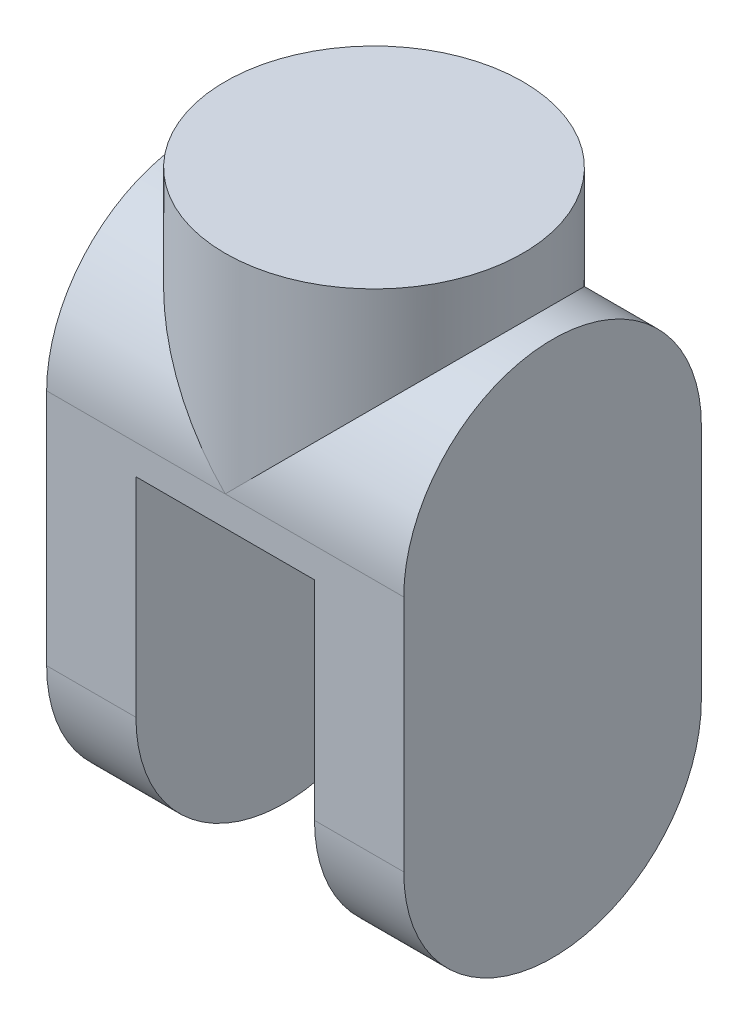
ISO-10303-21;
HEADER;
FILE_DESCRIPTION(('STEP AP214'),'2;1');
FILE_NAME('part.step','',(''),(''),'','','');
FILE_SCHEMA(('AUTOMOTIVE_DESIGN { 1 0 10303 214 1 1 1 1 }'));
ENDSEC;
DATA;
#1=APPLICATION_CONTEXT('core data for automotive mechanical design processes');
#2=APPLICATION_PROTOCOL_DEFINITION('international standard','automotive_design',2000,#1);
#3=PRODUCT_CONTEXT('',#1,'mechanical');
#4=PRODUCT('Part','Part','',(#3));
#5=PRODUCT_RELATED_PRODUCT_CATEGORY('part','',(#4));
#6=PRODUCT_DEFINITION_FORMATION('','',#4);
#7=PRODUCT_DEFINITION_CONTEXT('part definition',#1,'design');
#8=PRODUCT_DEFINITION('design','',#6,#7);
#9=PRODUCT_DEFINITION_SHAPE('','',#8);
#10=(LENGTH_UNIT() NAMED_UNIT(*) SI_UNIT(.MILLI.,.METRE.));
#11=(NAMED_UNIT(*) PLANE_ANGLE_UNIT() SI_UNIT($,.RADIAN.));
#12=(NAMED_UNIT(*) SI_UNIT($,.STERADIAN.) SOLID_ANGLE_UNIT());
#13=UNCERTAINTY_MEASURE_WITH_UNIT(LENGTH_MEASURE(1.E-05),#10,'distance_accuracy_value','');
#14=(GEOMETRIC_REPRESENTATION_CONTEXT(3) GLOBAL_UNCERTAINTY_ASSIGNED_CONTEXT((#13)) GLOBAL_UNIT_ASSIGNED_CONTEXT((#10,
#11,#12)) REPRESENTATION_CONTEXT('',''));
#15=CARTESIAN_POINT('',(0.,0.,0.));
#16=DIRECTION('',(0.,0.,1.));
#17=DIRECTION('',(1.,0.,0.));
#18=AXIS2_PLACEMENT_3D('',#15,#16,#17);
#19=CARTESIAN_POINT('',(60.,80.,0.));
#20=DIRECTION('',(-1.,0.,0.));
#21=DIRECTION('',(0.,0.,1.));
#22=AXIS2_PLACEMENT_3D('',#19,#20,#21);
#23=CYLINDRICAL_SURFACE('',#22,50.);
#24=DIRECTION('',(-1.,0.,0.));
#25=VECTOR('',#24,1.);
#26=CARTESIAN_POINT('',(60.,80.,-50.));
#27=LINE('',#26,#25);
#28=CARTESIAN_POINT('',(60.,80.,-50.));
#29=VERTEX_POINT('',#28);
#30=CARTESIAN_POINT('',(0.,80.,-50.));
#31=VERTEX_POINT('',#30);
#32=EDGE_CURVE('E118',#29,#31,#27,.T.);
#33=ORIENTED_EDGE('',*,*,#32,.T.);
#34=CARTESIAN_POINT('',(0.,80.,0.));
#35=DIRECTION('',(-0.707106781186547,0.707106781186547,0.));
#36=DIRECTION('',(0.707106781186547,0.707106781186547,0.));
#37=AXIS2_PLACEMENT_3D('',#34,#35,#36);
#38=ELLIPSE('',#37,70.7106781186548,50.);
#39=CARTESIAN_POINT('',(0.,80.,50.));
#40=VERTEX_POINT('',#39);
#41=EDGE_CURVE('E49',#40,#31,#38,.T.);
#42=ORIENTED_EDGE('',*,*,#41,.F.);
#43=DIRECTION('',(-1.,0.,0.));
#44=VECTOR('',#43,1.);
#45=CARTESIAN_POINT('',(60.,80.,50.));
#46=LINE('',#45,#44);
#47=CARTESIAN_POINT('',(60.,80.,50.));
#48=VERTEX_POINT('',#47);
#49=EDGE_CURVE('E115',#48,#40,#46,.T.);
#50=ORIENTED_EDGE('',*,*,#49,.F.);
#51=CARTESIAN_POINT('',(60.,80.,0.));
#52=DIRECTION('',(1.,0.,0.));
#53=DIRECTION('',(0.,0.,-1.));
#54=AXIS2_PLACEMENT_3D('',#51,#52,#53);
#55=CIRCLE('',#54,50.);
#56=EDGE_CURVE('E174',#29,#48,#55,.T.);
#57=ORIENTED_EDGE('',*,*,#56,.F.);
#58=EDGE_LOOP('',(#33,#42,#50,#57));
#59=FACE_BOUND('',#58,.T.);
#60=ADVANCED_FACE('F35',(#59),#23,.T.);
#61=CARTESIAN_POINT('',(60.,0.,0.));
#62=DIRECTION('',(-1.,0.,0.));
#63=DIRECTION('',(0.,0.,1.));
#64=AXIS2_PLACEMENT_3D('',#61,#62,#63);
#65=CYLINDRICAL_SURFACE('',#64,50.);
#66=CARTESIAN_POINT('',(-30.,0.,0.));
#67=DIRECTION('',(1.,0.,0.));
#68=DIRECTION('',(0.,0.,-1.));
#69=AXIS2_PLACEMENT_3D('',#66,#67,#68);
#70=CIRCLE('',#69,50.);
#71=CARTESIAN_POINT('',(-30.,0.,50.));
#72=VERTEX_POINT('',#71);
#73=CARTESIAN_POINT('',(-30.,0.,-50.));
#74=VERTEX_POINT('',#73);
#75=EDGE_CURVE('E193',#72,#74,#70,.T.);
#76=ORIENTED_EDGE('',*,*,#75,.F.);
#77=DIRECTION('',(-1.,0.,0.));
#78=VECTOR('',#77,1.);
#79=CARTESIAN_POINT('',(60.,0.,50.));
#80=LINE('',#79,#78);
#81=CARTESIAN_POINT('',(-60.,0.,50.));
#82=VERTEX_POINT('',#81);
#83=EDGE_CURVE('E157',#72,#82,#80,.T.);
#84=ORIENTED_EDGE('',*,*,#83,.T.);
#85=CARTESIAN_POINT('',(-60.,0.,0.));
#86=DIRECTION('',(1.,0.,0.));
#87=DIRECTION('',(0.,0.,-1.));
#88=AXIS2_PLACEMENT_3D('',#85,#86,#87);
#89=CIRCLE('',#88,50.);
#90=CARTESIAN_POINT('',(-60.,0.,-50.));
#91=VERTEX_POINT('',#90);
#92=EDGE_CURVE('E153',#82,#91,#89,.T.);
#93=ORIENTED_EDGE('',*,*,#92,.T.);
#94=DIRECTION('',(-1.,0.,0.));
#95=VECTOR('',#94,1.);
#96=CARTESIAN_POINT('',(60.,0.,-50.));
#97=LINE('',#96,#95);
#98=EDGE_CURVE('E43',#74,#91,#97,.T.);
#99=ORIENTED_EDGE('',*,*,#98,.F.);
#100=EDGE_LOOP('',(#76,#84,#93,#99));
#101=FACE_BOUND('',#100,.T.);
#102=ADVANCED_FACE('F155',(#101),#65,.T.);
#103=CARTESIAN_POINT('',(60.,0.,-50.));
#104=DIRECTION('',(0.,0.,1.));
#105=DIRECTION('',(0.,-1.,0.));
#106=AXIS2_PLACEMENT_3D('',#103,#104,#105);
#107=PLANE('',#106);
#108=DIRECTION('',(0.,1.,0.));
#109=VECTOR('',#108,1.);
#110=CARTESIAN_POINT('',(-30.,70.,-50.));
#111=LINE('',#110,#109);
#112=CARTESIAN_POINT('',(-30.,70.,-50.));
#113=VERTEX_POINT('',#112);
#114=EDGE_CURVE('E146',#74,#113,#111,.T.);
#115=ORIENTED_EDGE('',*,*,#114,.F.);
#116=ORIENTED_EDGE('',*,*,#98,.T.);
#117=DIRECTION('',(0.,1.,0.));
#118=VECTOR('',#117,1.);
#119=CARTESIAN_POINT('',(-60.,0.,-50.));
#120=LINE('',#119,#118);
#121=CARTESIAN_POINT('',(-60.,80.,-50.));
#122=VERTEX_POINT('',#121);
#123=EDGE_CURVE('E144',#91,#122,#120,.T.);
#124=ORIENTED_EDGE('',*,*,#123,.T.);
#125=EDGE_CURVE('E135',#31,#122,#27,.T.);
#126=ORIENTED_EDGE('',*,*,#125,.F.);
#127=ORIENTED_EDGE('',*,*,#32,.F.);
#128=DIRECTION('',(0.,1.,0.));
#129=VECTOR('',#128,1.);
#130=CARTESIAN_POINT('',(60.,0.,-50.));
#131=LINE('',#130,#129);
#132=CARTESIAN_POINT('',(60.,0.,-50.));
#133=VERTEX_POINT('',#132);
#134=EDGE_CURVE('E169',#133,#29,#131,.T.);
#135=ORIENTED_EDGE('',*,*,#134,.F.);
#136=CARTESIAN_POINT('',(30.,0.,-50.));
#137=VERTEX_POINT('',#136);
#138=EDGE_CURVE('E11',#133,#137,#97,.T.);
#139=ORIENTED_EDGE('',*,*,#138,.T.);
#140=DIRECTION('',(0.,1.,0.));
#141=VECTOR('',#140,1.);
#142=CARTESIAN_POINT('',(30.,70.,-50.));
#143=LINE('',#142,#141);
#144=CARTESIAN_POINT('',(30.,70.,-50.));
#145=VERTEX_POINT('',#144);
#146=EDGE_CURVE('E182',#137,#145,#143,.T.);
#147=ORIENTED_EDGE('',*,*,#146,.T.);
#148=DIRECTION('',(1.,0.,0.));
#149=VECTOR('',#148,1.);
#150=CARTESIAN_POINT('',(-30.,70.,-50.));
#151=LINE('',#150,#149);
#152=EDGE_CURVE('E161',#113,#145,#151,.T.);
#153=ORIENTED_EDGE('',*,*,#152,.F.);
#154=EDGE_LOOP('',(#115,#116,#124,#126,#127,#135,#139,#147,#153));
#155=FACE_BOUND('',#154,.T.);
#156=ADVANCED_FACE('F143',(#155),#107,.F.);
#157=CARTESIAN_POINT('',(60.,80.,50.));
#158=DIRECTION('',(0.,0.,-1.));
#159=DIRECTION('',(0.,1.,0.));
#160=AXIS2_PLACEMENT_3D('',#157,#158,#159);
#161=PLANE('',#160);
#162=DIRECTION('',(0.,-1.,0.));
#163=VECTOR('',#162,1.);
#164=CARTESIAN_POINT('',(-30.,70.,50.));
#165=LINE('',#164,#163);
#166=CARTESIAN_POINT('',(-30.,70.,50.));
#167=VERTEX_POINT('',#166);
#168=EDGE_CURVE('E191',#167,#72,#165,.T.);
#169=ORIENTED_EDGE('',*,*,#168,.F.);
#170=DIRECTION('',(1.,0.,0.));
#171=VECTOR('',#170,1.);
#172=CARTESIAN_POINT('',(-30.,70.,50.));
#173=LINE('',#172,#171);
#174=CARTESIAN_POINT('',(30.,70.,50.));
#175=VERTEX_POINT('',#174);
#176=EDGE_CURVE('E158',#167,#175,#173,.T.);
#177=ORIENTED_EDGE('',*,*,#176,.T.);
#178=DIRECTION('',(0.,-1.,0.));
#179=VECTOR('',#178,1.);
#180=CARTESIAN_POINT('',(30.,70.,50.));
#181=LINE('',#180,#179);
#182=CARTESIAN_POINT('',(30.,0.,50.));
#183=VERTEX_POINT('',#182);
#184=EDGE_CURVE('E119',#175,#183,#181,.T.);
#185=ORIENTED_EDGE('',*,*,#184,.T.);
#186=CARTESIAN_POINT('',(60.,0.,50.));
#187=VERTEX_POINT('',#186);
#188=EDGE_CURVE('E129',#187,#183,#80,.T.);
#189=ORIENTED_EDGE('',*,*,#188,.F.);
#190=DIRECTION('',(0.,-1.,0.));
#191=VECTOR('',#190,1.);
#192=CARTESIAN_POINT('',(60.,80.,50.));
#193=LINE('',#192,#191);
#194=EDGE_CURVE('E134',#48,#187,#193,.T.);
#195=ORIENTED_EDGE('',*,*,#194,.F.);
#196=ORIENTED_EDGE('',*,*,#49,.T.);
#197=CARTESIAN_POINT('',(-60.,80.,50.));
#198=VERTEX_POINT('',#197);
#199=EDGE_CURVE('E122',#40,#198,#46,.T.);
#200=ORIENTED_EDGE('',*,*,#199,.T.);
#201=DIRECTION('',(0.,-1.,0.));
#202=VECTOR('',#201,1.);
#203=CARTESIAN_POINT('',(-60.,80.,50.));
#204=LINE('',#203,#202);
#205=EDGE_CURVE('E166',#198,#82,#204,.T.);
#206=ORIENTED_EDGE('',*,*,#205,.T.);
#207=ORIENTED_EDGE('',*,*,#83,.F.);
#208=EDGE_LOOP('',(#169,#177,#185,#189,#195,#196,#200,#206,#207));
#209=FACE_BOUND('',#208,.T.);
#210=ADVANCED_FACE('F132',(#209),#161,.F.);
#211=ORIENTED_EDGE('',*,*,#188,.T.);
#212=CARTESIAN_POINT('',(30.,0.,0.));
#213=DIRECTION('',(1.,0.,0.));
#214=DIRECTION('',(0.,0.,-1.));
#215=AXIS2_PLACEMENT_3D('',#212,#213,#214);
#216=CIRCLE('',#215,50.);
#217=EDGE_CURVE('E57',#183,#137,#216,.T.);
#218=ORIENTED_EDGE('',*,*,#217,.T.);
#219=ORIENTED_EDGE('',*,*,#138,.F.);
#220=CARTESIAN_POINT('',(60.,0.,0.));
#221=DIRECTION('',(1.,0.,0.));
#222=DIRECTION('',(0.,0.,-1.));
#223=AXIS2_PLACEMENT_3D('',#220,#221,#222);
#224=CIRCLE('',#223,50.);
#225=EDGE_CURVE('E167',#187,#133,#224,.T.);
#226=ORIENTED_EDGE('',*,*,#225,.F.);
#227=EDGE_LOOP('',(#211,#218,#219,#226));
#228=FACE_BOUND('',#227,.T.);
#229=ADVANCED_FACE('F37',(#228),#65,.T.);
#230=ORIENTED_EDGE('',*,*,#199,.F.);
#231=CARTESIAN_POINT('',(0.,80.,0.));
#232=DIRECTION('',(0.707106781186547,0.707106781186547,0.));
#233=DIRECTION('',(-0.707106781186547,0.707106781186547,0.));
#234=AXIS2_PLACEMENT_3D('',#231,#232,#233);
#235=ELLIPSE('',#234,70.7106781186548,50.);
#236=EDGE_CURVE('E103',#31,#40,#235,.T.);
#237=ORIENTED_EDGE('',*,*,#236,.F.);
#238=ORIENTED_EDGE('',*,*,#125,.T.);
#239=CARTESIAN_POINT('',(-60.,80.,0.));
#240=DIRECTION('',(1.,0.,0.));
#241=DIRECTION('',(0.,0.,-1.));
#242=AXIS2_PLACEMENT_3D('',#239,#240,#241);
#243=CIRCLE('',#242,50.);
#244=EDGE_CURVE('E125',#122,#198,#243,.T.);
#245=ORIENTED_EDGE('',*,*,#244,.T.);
#246=EDGE_LOOP('',(#230,#237,#238,#245));
#247=FACE_BOUND('',#246,.T.);
#248=ADVANCED_FACE('F123',(#247),#23,.T.);
#249=CARTESIAN_POINT('',(60.,0.,0.));
#250=DIRECTION('',(1.,0.,0.));
#251=DIRECTION('',(0.,0.,-1.));
#252=AXIS2_PLACEMENT_3D('',#249,#250,#251);
#253=PLANE('',#252);
#254=ORIENTED_EDGE('',*,*,#225,.T.);
#255=ORIENTED_EDGE('',*,*,#134,.T.);
#256=ORIENTED_EDGE('',*,*,#56,.T.);
#257=ORIENTED_EDGE('',*,*,#194,.T.);
#258=EDGE_LOOP('',(#254,#255,#256,#257));
#259=FACE_BOUND('',#258,.T.);
#260=ADVANCED_FACE('F201',(#259),#253,.T.);
#261=CARTESIAN_POINT('',(-60.,0.,0.));
#262=DIRECTION('',(1.,0.,0.));
#263=DIRECTION('',(0.,0.,-1.));
#264=AXIS2_PLACEMENT_3D('',#261,#262,#263);
#265=PLANE('',#264);
#266=ORIENTED_EDGE('',*,*,#92,.F.);
#267=ORIENTED_EDGE('',*,*,#205,.F.);
#268=ORIENTED_EDGE('',*,*,#244,.F.);
#269=ORIENTED_EDGE('',*,*,#123,.F.);
#270=EDGE_LOOP('',(#266,#267,#268,#269));
#271=FACE_BOUND('',#270,.T.);
#272=ADVANCED_FACE('F152',(#271),#265,.F.);
#273=CARTESIAN_POINT('',(-30.,70.,50.));
#274=DIRECTION('',(0.,1.,0.));
#275=DIRECTION('',(0.,0.,1.));
#276=AXIS2_PLACEMENT_3D('',#273,#274,#275);
#277=PLANE('',#276);
#278=DIRECTION('',(0.,0.,1.));
#279=VECTOR('',#278,1.);
#280=CARTESIAN_POINT('',(30.,70.,50.));
#281=LINE('',#280,#279);
#282=EDGE_CURVE('E190',#145,#175,#281,.T.);
#283=ORIENTED_EDGE('',*,*,#282,.T.);
#284=ORIENTED_EDGE('',*,*,#176,.F.);
#285=DIRECTION('',(0.,0.,1.));
#286=VECTOR('',#285,1.);
#287=CARTESIAN_POINT('',(-30.,70.,50.));
#288=LINE('',#287,#286);
#289=EDGE_CURVE('E185',#113,#167,#288,.T.);
#290=ORIENTED_EDGE('',*,*,#289,.F.);
#291=ORIENTED_EDGE('',*,*,#152,.T.);
#292=EDGE_LOOP('',(#283,#284,#290,#291));
#293=FACE_BOUND('',#292,.T.);
#294=ADVANCED_FACE('F199',(#293),#277,.F.);
#295=CARTESIAN_POINT('',(-30.,0.,0.));
#296=DIRECTION('',(1.,0.,0.));
#297=DIRECTION('',(0.,0.,-1.));
#298=AXIS2_PLACEMENT_3D('',#295,#296,#297);
#299=PLANE('',#298);
#300=ORIENTED_EDGE('',*,*,#168,.T.);
#301=ORIENTED_EDGE('',*,*,#75,.T.);
#302=ORIENTED_EDGE('',*,*,#114,.T.);
#303=ORIENTED_EDGE('',*,*,#289,.T.);
#304=EDGE_LOOP('',(#300,#301,#302,#303));
#305=FACE_BOUND('',#304,.T.);
#306=ADVANCED_FACE('F260',(#305),#299,.T.);
#307=CARTESIAN_POINT('',(30.,0.,0.));
#308=DIRECTION('',(1.,0.,0.));
#309=DIRECTION('',(0.,0.,-1.));
#310=AXIS2_PLACEMENT_3D('',#307,#308,#309);
#311=PLANE('',#310);
#312=ORIENTED_EDGE('',*,*,#184,.F.);
#313=ORIENTED_EDGE('',*,*,#282,.F.);
#314=ORIENTED_EDGE('',*,*,#146,.F.);
#315=ORIENTED_EDGE('',*,*,#217,.F.);
#316=EDGE_LOOP('',(#312,#313,#314,#315));
#317=FACE_BOUND('',#316,.T.);
#318=ADVANCED_FACE('F200',(#317),#311,.F.);
#319=CARTESIAN_POINT('',(0.,-50.002,0.));
#320=DIRECTION('',(0.,1.,0.));
#321=DIRECTION('',(0.,0.,1.));
#322=AXIS2_PLACEMENT_3D('',#319,#320,#321);
#323=CYLINDRICAL_SURFACE('',#322,50.);
#324=CARTESIAN_POINT('',(0.,150.,0.));
#325=DIRECTION('',(0.,1.,0.));
#326=DIRECTION('',(0.,0.,1.));
#327=AXIS2_PLACEMENT_3D('',#324,#325,#326);
#328=CIRCLE('',#327,50.);
#329=CARTESIAN_POINT('',(0.,150.,50.));
#330=VERTEX_POINT('',#329);
#331=EDGE_CURVE('E108',#330,#330,#328,.T.);
#332=ORIENTED_EDGE('',*,*,#331,.F.);
#333=EDGE_LOOP('',(#332));
#334=FACE_BOUND('',#333,.T.);
#335=ORIENTED_EDGE('',*,*,#236,.T.);
#336=ORIENTED_EDGE('',*,*,#41,.T.);
#337=EDGE_LOOP('',(#335,#336));
#338=FACE_BOUND('',#337,.T.);
#339=ADVANCED_FACE('F104',(#334,#338),#323,.T.);
#340=CARTESIAN_POINT('',(0.,150.,0.));
#341=DIRECTION('',(0.,1.,0.));
#342=DIRECTION('',(0.,0.,1.));
#343=AXIS2_PLACEMENT_3D('',#340,#341,#342);
#344=PLANE('',#343);
#345=ORIENTED_EDGE('',*,*,#331,.T.);
#346=EDGE_LOOP('',(#345));
#347=FACE_BOUND('',#346,.T.);
#348=ADVANCED_FACE('F243',(#347),#344,.T.);
#349=CLOSED_SHELL('',(#60,#102,#156,#210,#229,#248,#260,#272,#294,#306,#318,#339,#348));
#350=MANIFOLD_SOLID_BREP('B2',#349);
#351=ADVANCED_BREP_SHAPE_REPRESENTATION('',(#18,#350),#14);
#352=SHAPE_DEFINITION_REPRESENTATION(#9,#351);
ENDSEC;
END-ISO-10303-21;
